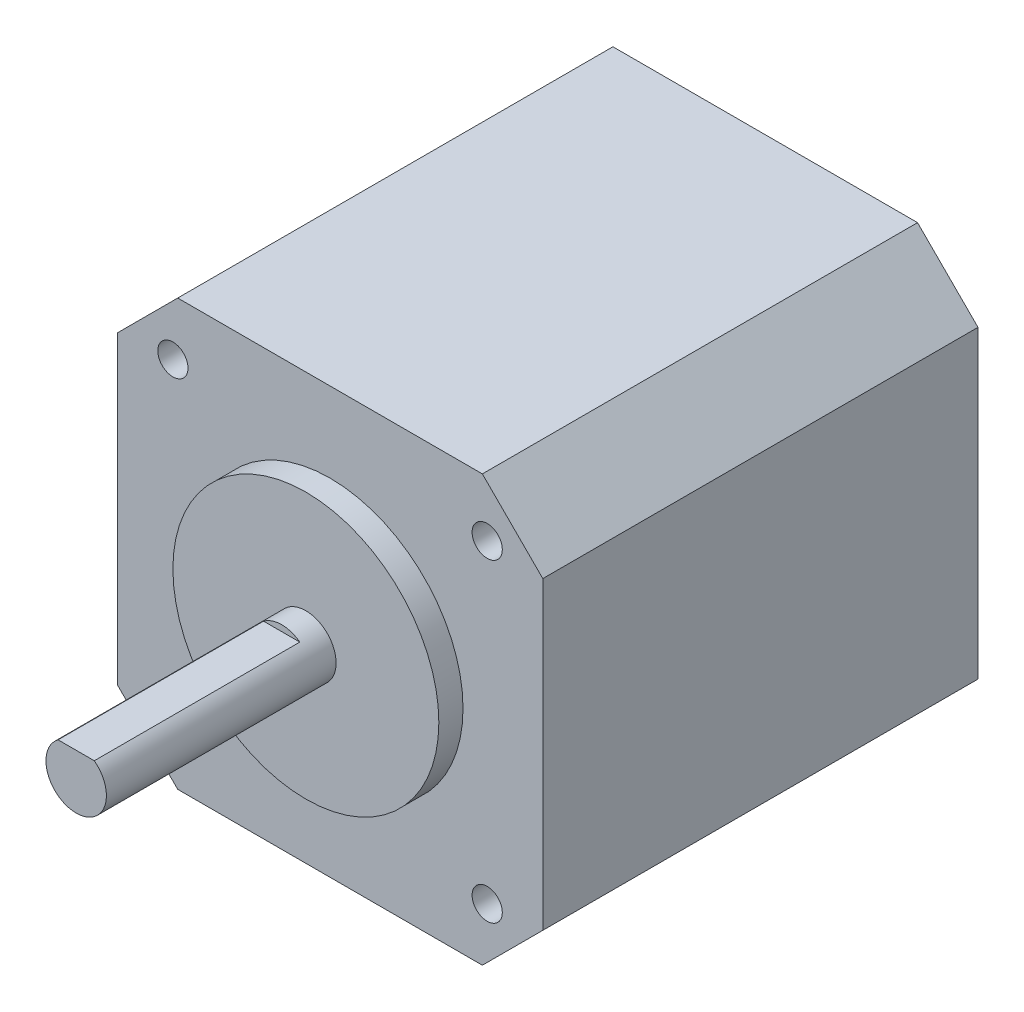
ISO-10303-21;
HEADER;
FILE_DESCRIPTION(('STEP AP214'),'2;1');
FILE_NAME('part.step','',(''),(''),'','','');
FILE_SCHEMA(('AUTOMOTIVE_DESIGN { 1 0 10303 214 1 1 1 1 }'));
ENDSEC;
DATA;
#1=APPLICATION_CONTEXT('core data for automotive mechanical design processes');
#2=APPLICATION_PROTOCOL_DEFINITION('international standard','automotive_design',2000,#1);
#3=PRODUCT_CONTEXT('',#1,'mechanical');
#4=PRODUCT('Part','Part','',(#3));
#5=PRODUCT_RELATED_PRODUCT_CATEGORY('part','',(#4));
#6=PRODUCT_DEFINITION_FORMATION('','',#4);
#7=PRODUCT_DEFINITION_CONTEXT('part definition',#1,'design');
#8=PRODUCT_DEFINITION('design','',#6,#7);
#9=PRODUCT_DEFINITION_SHAPE('','',#8);
#10=(LENGTH_UNIT() NAMED_UNIT(*) SI_UNIT(.MILLI.,.METRE.));
#11=(NAMED_UNIT(*) PLANE_ANGLE_UNIT() SI_UNIT($,.RADIAN.));
#12=(NAMED_UNIT(*) SI_UNIT($,.STERADIAN.) SOLID_ANGLE_UNIT());
#13=UNCERTAINTY_MEASURE_WITH_UNIT(LENGTH_MEASURE(1.E-05),#10,'distance_accuracy_value','');
#14=(GEOMETRIC_REPRESENTATION_CONTEXT(3) GLOBAL_UNCERTAINTY_ASSIGNED_CONTEXT((#13)) GLOBAL_UNIT_ASSIGNED_CONTEXT((#10,
#11,#12)) REPRESENTATION_CONTEXT('',''));
#15=CARTESIAN_POINT('',(0.,0.,0.));
#16=DIRECTION('',(0.,0.,1.));
#17=DIRECTION('',(1.,0.,0.));
#18=AXIS2_PLACEMENT_3D('',#15,#16,#17);
#19=CARTESIAN_POINT('',(0.,0.,38.));
#20=DIRECTION('',(0.,0.,1.));
#21=DIRECTION('',(1.,0.,0.));
#22=AXIS2_PLACEMENT_3D('',#19,#20,#21);
#23=PLANE('',#22);
#24=CARTESIAN_POINT('',(0.,0.,38.));
#25=DIRECTION('',(0.,0.,1.));
#26=DIRECTION('',(1.,0.,0.));
#27=AXIS2_PLACEMENT_3D('',#24,#25,#26);
#28=CIRCLE('',#27,11.);
#29=CARTESIAN_POINT('',(11.,0.,38.));
#30=VERTEX_POINT('',#29);
#31=EDGE_CURVE('E211',#30,#30,#28,.T.);
#32=ORIENTED_EDGE('',*,*,#31,.T.);
#33=EDGE_LOOP('',(#32));
#34=FACE_BOUND('',#33,.T.);
#35=CARTESIAN_POINT('',(0.,0.,38.));
#36=DIRECTION('',(0.,0.,1.));
#37=DIRECTION('',(1.,0.,0.));
#38=AXIS2_PLACEMENT_3D('',#35,#36,#37);
#39=CIRCLE('',#38,2.5);
#40=CARTESIAN_POINT('',(2.5,0.,38.));
#41=VERTEX_POINT('',#40);
#42=EDGE_CURVE('E207',#41,#41,#39,.T.);
#43=ORIENTED_EDGE('',*,*,#42,.F.);
#44=EDGE_LOOP('',(#43));
#45=FACE_BOUND('',#44,.T.);
#46=ADVANCED_FACE('F43',(#34,#45),#23,.T.);
#47=CARTESIAN_POINT('',(-17.6,17.6,36.));
#48=DIRECTION('',(0.,0.,-1.));
#49=DIRECTION('',(-1.,0.,0.));
#50=AXIS2_PLACEMENT_3D('',#47,#48,#49);
#51=PLANE('',#50);
#52=CARTESIAN_POINT('',(-12.9999999999999,13.0000000000001,36.));
#53=DIRECTION('',(0.,0.,1.));
#54=DIRECTION('',(1.,0.,0.));
#55=AXIS2_PLACEMENT_3D('',#52,#53,#54);
#56=CIRCLE('',#55,1.25);
#57=CARTESIAN_POINT('',(-11.7499999999999,13.0000000000001,36.));
#58=VERTEX_POINT('',#57);
#59=EDGE_CURVE('E183',#58,#58,#56,.T.);
#60=ORIENTED_EDGE('',*,*,#59,.F.);
#61=EDGE_LOOP('',(#60));
#62=FACE_BOUND('',#61,.T.);
#63=CARTESIAN_POINT('',(-13.,-13.,36.));
#64=DIRECTION('',(0.,0.,1.));
#65=DIRECTION('',(1.,0.,0.));
#66=AXIS2_PLACEMENT_3D('',#63,#64,#65);
#67=CIRCLE('',#66,1.25);
#68=CARTESIAN_POINT('',(-11.75,-13.,36.));
#69=VERTEX_POINT('',#68);
#70=EDGE_CURVE('E189',#69,#69,#67,.T.);
#71=ORIENTED_EDGE('',*,*,#70,.F.);
#72=EDGE_LOOP('',(#71));
#73=FACE_BOUND('',#72,.T.);
#74=CARTESIAN_POINT('',(13.,-13.,36.));
#75=DIRECTION('',(0.,0.,1.));
#76=DIRECTION('',(1.,0.,0.));
#77=AXIS2_PLACEMENT_3D('',#74,#75,#76);
#78=CIRCLE('',#77,1.25);
#79=CARTESIAN_POINT('',(14.25,-13.,36.));
#80=VERTEX_POINT('',#79);
#81=EDGE_CURVE('E195',#80,#80,#78,.T.);
#82=ORIENTED_EDGE('',*,*,#81,.F.);
#83=EDGE_LOOP('',(#82));
#84=FACE_BOUND('',#83,.T.);
#85=CARTESIAN_POINT('',(13.,13.,36.));
#86=DIRECTION('',(0.,0.,1.));
#87=DIRECTION('',(1.,0.,0.));
#88=AXIS2_PLACEMENT_3D('',#85,#86,#87);
#89=CIRCLE('',#88,1.25);
#90=CARTESIAN_POINT('',(14.25,13.,36.));
#91=VERTEX_POINT('',#90);
#92=EDGE_CURVE('E201',#91,#91,#89,.T.);
#93=ORIENTED_EDGE('',*,*,#92,.F.);
#94=EDGE_LOOP('',(#93));
#95=FACE_BOUND('',#94,.T.);
#96=DIRECTION('',(-1.,0.,0.));
#97=VECTOR('',#96,1.);
#98=CARTESIAN_POINT('',(-17.6,17.6,36.));
#99=LINE('',#98,#97);
#100=CARTESIAN_POINT('',(12.6,17.6,36.));
#101=VERTEX_POINT('',#100);
#102=CARTESIAN_POINT('',(-12.6,17.6,36.));
#103=VERTEX_POINT('',#102);
#104=EDGE_CURVE('E226',#101,#103,#99,.T.);
#105=ORIENTED_EDGE('',*,*,#104,.T.);
#106=DIRECTION('',(0.707106781186549,0.707106781186546,0.));
#107=VECTOR('',#106,1.);
#108=CARTESIAN_POINT('',(-17.6,12.6,36.));
#109=LINE('',#108,#107);
#110=CARTESIAN_POINT('',(-17.6,12.6,36.));
#111=VERTEX_POINT('',#110);
#112=EDGE_CURVE('E265',#103,#111,#109,.F.);
#113=ORIENTED_EDGE('',*,*,#112,.T.);
#114=DIRECTION('',(0.,-1.,0.));
#115=VECTOR('',#114,1.);
#116=CARTESIAN_POINT('',(-17.6,-17.6,36.));
#117=LINE('',#116,#115);
#118=CARTESIAN_POINT('',(-17.6,-12.6,36.));
#119=VERTEX_POINT('',#118);
#120=EDGE_CURVE('E217',#111,#119,#117,.T.);
#121=ORIENTED_EDGE('',*,*,#120,.T.);
#122=DIRECTION('',(-0.707106781186546,0.707106781186549,0.));
#123=VECTOR('',#122,1.);
#124=CARTESIAN_POINT('',(-12.6,-17.6,36.));
#125=LINE('',#124,#123);
#126=CARTESIAN_POINT('',(-12.6,-17.6,36.));
#127=VERTEX_POINT('',#126);
#128=EDGE_CURVE('E263',#119,#127,#125,.F.);
#129=ORIENTED_EDGE('',*,*,#128,.T.);
#130=DIRECTION('',(1.,0.,0.));
#131=VECTOR('',#130,1.);
#132=CARTESIAN_POINT('',(-17.6,-17.6,36.));
#133=LINE('',#132,#131);
#134=CARTESIAN_POINT('',(12.6,-17.6,36.));
#135=VERTEX_POINT('',#134);
#136=EDGE_CURVE('E220',#127,#135,#133,.T.);
#137=ORIENTED_EDGE('',*,*,#136,.T.);
#138=DIRECTION('',(-0.707106781186549,-0.707106781186546,0.));
#139=VECTOR('',#138,1.);
#140=CARTESIAN_POINT('',(17.6,-12.6,36.));
#141=LINE('',#140,#139);
#142=CARTESIAN_POINT('',(17.6,-12.6,36.));
#143=VERTEX_POINT('',#142);
#144=EDGE_CURVE('E261',#135,#143,#141,.F.);
#145=ORIENTED_EDGE('',*,*,#144,.T.);
#146=DIRECTION('',(0.,1.,0.));
#147=VECTOR('',#146,1.);
#148=CARTESIAN_POINT('',(17.6,-17.6,36.));
#149=LINE('',#148,#147);
#150=CARTESIAN_POINT('',(17.6,12.6,36.));
#151=VERTEX_POINT('',#150);
#152=EDGE_CURVE('E224',#143,#151,#149,.T.);
#153=ORIENTED_EDGE('',*,*,#152,.T.);
#154=DIRECTION('',(0.707106781186546,-0.707106781186549,0.));
#155=VECTOR('',#154,1.);
#156=CARTESIAN_POINT('',(12.6,17.6,36.));
#157=LINE('',#156,#155);
#158=EDGE_CURVE('E259',#151,#101,#157,.F.);
#159=ORIENTED_EDGE('',*,*,#158,.T.);
#160=EDGE_LOOP('',(#105,#113,#121,#129,#137,#145,#153,#159));
#161=FACE_BOUND('',#160,.T.);
#162=CARTESIAN_POINT('',(0.,0.,36.));
#163=DIRECTION('',(0.,0.,-1.));
#164=DIRECTION('',(-1.,0.,0.));
#165=AXIS2_PLACEMENT_3D('',#162,#163,#164);
#166=CIRCLE('',#165,11.);
#167=CARTESIAN_POINT('',(-11.,0.,36.));
#168=VERTEX_POINT('',#167);
#169=EDGE_CURVE('E229',#168,#168,#166,.F.);
#170=ORIENTED_EDGE('',*,*,#169,.F.);
#171=EDGE_LOOP('',(#170));
#172=FACE_BOUND('',#171,.T.);
#173=ADVANCED_FACE('F298',(#62,#73,#84,#95,#161,#172),#51,.F.);
#174=CARTESIAN_POINT('',(-17.6,-17.6,36.));
#175=DIRECTION('',(1.,0.,0.));
#176=DIRECTION('',(0.,0.,-1.));
#177=AXIS2_PLACEMENT_3D('',#174,#175,#176);
#178=PLANE('',#177);
#179=ORIENTED_EDGE('',*,*,#120,.F.);
#180=DIRECTION('',(0.,0.,-1.));
#181=VECTOR('',#180,1.);
#182=CARTESIAN_POINT('',(-17.6,12.6,36.));
#183=LINE('',#182,#181);
#184=CARTESIAN_POINT('',(-17.6,12.6,0.));
#185=VERTEX_POINT('',#184);
#186=EDGE_CURVE('E243',#111,#185,#183,.T.);
#187=ORIENTED_EDGE('',*,*,#186,.T.);
#188=DIRECTION('',(0.,-1.,0.));
#189=VECTOR('',#188,1.);
#190=CARTESIAN_POINT('',(-17.6,-17.6,0.));
#191=LINE('',#190,#189);
#192=CARTESIAN_POINT('',(-17.6,-12.6,0.));
#193=VERTEX_POINT('',#192);
#194=EDGE_CURVE('E216',#185,#193,#191,.T.);
#195=ORIENTED_EDGE('',*,*,#194,.T.);
#196=DIRECTION('',(0.,0.,1.));
#197=VECTOR('',#196,1.);
#198=CARTESIAN_POINT('',(-17.6,-12.6,36.));
#199=LINE('',#198,#197);
#200=EDGE_CURVE('E241',#193,#119,#199,.T.);
#201=ORIENTED_EDGE('',*,*,#200,.T.);
#202=EDGE_LOOP('',(#179,#187,#195,#201));
#203=FACE_BOUND('',#202,.T.);
#204=ADVANCED_FACE('F304',(#203),#178,.F.);
#205=CARTESIAN_POINT('',(-17.6,-17.6,36.));
#206=DIRECTION('',(0.,1.,0.));
#207=DIRECTION('',(0.,0.,1.));
#208=AXIS2_PLACEMENT_3D('',#205,#206,#207);
#209=PLANE('',#208);
#210=ORIENTED_EDGE('',*,*,#136,.F.);
#211=DIRECTION('',(0.,0.,-1.));
#212=VECTOR('',#211,1.);
#213=CARTESIAN_POINT('',(-12.6,-17.6,36.));
#214=LINE('',#213,#212);
#215=CARTESIAN_POINT('',(-12.6,-17.6,0.));
#216=VERTEX_POINT('',#215);
#217=EDGE_CURVE('E269',#127,#216,#214,.T.);
#218=ORIENTED_EDGE('',*,*,#217,.T.);
#219=DIRECTION('',(1.,0.,0.));
#220=VECTOR('',#219,1.);
#221=CARTESIAN_POINT('',(-17.6,-17.6,0.));
#222=LINE('',#221,#220);
#223=CARTESIAN_POINT('',(12.6,-17.6,0.));
#224=VERTEX_POINT('',#223);
#225=EDGE_CURVE('E232',#216,#224,#222,.T.);
#226=ORIENTED_EDGE('',*,*,#225,.T.);
#227=DIRECTION('',(0.,0.,1.));
#228=VECTOR('',#227,1.);
#229=CARTESIAN_POINT('',(12.6,-17.6,36.));
#230=LINE('',#229,#228);
#231=EDGE_CURVE('E267',#224,#135,#230,.T.);
#232=ORIENTED_EDGE('',*,*,#231,.T.);
#233=EDGE_LOOP('',(#210,#218,#226,#232));
#234=FACE_BOUND('',#233,.T.);
#235=ADVANCED_FACE('F323',(#234),#209,.F.);
#236=CARTESIAN_POINT('',(17.6,-17.6,36.));
#237=DIRECTION('',(-1.,0.,0.));
#238=DIRECTION('',(0.,0.,1.));
#239=AXIS2_PLACEMENT_3D('',#236,#237,#238);
#240=PLANE('',#239);
#241=ORIENTED_EDGE('',*,*,#152,.F.);
#242=DIRECTION('',(0.,0.,-1.));
#243=VECTOR('',#242,1.);
#244=CARTESIAN_POINT('',(17.6,-12.6,36.));
#245=LINE('',#244,#243);
#246=CARTESIAN_POINT('',(17.6,-12.6,0.));
#247=VERTEX_POINT('',#246);
#248=EDGE_CURVE('E273',#143,#247,#245,.T.);
#249=ORIENTED_EDGE('',*,*,#248,.T.);
#250=DIRECTION('',(0.,1.,0.));
#251=VECTOR('',#250,1.);
#252=CARTESIAN_POINT('',(17.6,-17.6,0.));
#253=LINE('',#252,#251);
#254=CARTESIAN_POINT('',(17.6,12.6,0.));
#255=VERTEX_POINT('',#254);
#256=EDGE_CURVE('E235',#247,#255,#253,.T.);
#257=ORIENTED_EDGE('',*,*,#256,.T.);
#258=DIRECTION('',(0.,0.,1.));
#259=VECTOR('',#258,1.);
#260=CARTESIAN_POINT('',(17.6,12.6,36.));
#261=LINE('',#260,#259);
#262=EDGE_CURVE('E66',#255,#151,#261,.T.);
#263=ORIENTED_EDGE('',*,*,#262,.T.);
#264=EDGE_LOOP('',(#241,#249,#257,#263));
#265=FACE_BOUND('',#264,.T.);
#266=ADVANCED_FACE('F319',(#265),#240,.F.);
#267=CARTESIAN_POINT('',(-17.6,17.6,36.));
#268=DIRECTION('',(0.,-1.,0.));
#269=DIRECTION('',(0.,0.,-1.));
#270=AXIS2_PLACEMENT_3D('',#267,#268,#269);
#271=PLANE('',#270);
#272=DIRECTION('',(-1.,0.,0.));
#273=VECTOR('',#272,1.);
#274=CARTESIAN_POINT('',(-17.6,17.6,0.));
#275=LINE('',#274,#273);
#276=CARTESIAN_POINT('',(12.6,17.6,0.));
#277=VERTEX_POINT('',#276);
#278=CARTESIAN_POINT('',(-12.6,17.6,0.));
#279=VERTEX_POINT('',#278);
#280=EDGE_CURVE('E221',#277,#279,#275,.T.);
#281=ORIENTED_EDGE('',*,*,#280,.T.);
#282=DIRECTION('',(0.,0.,1.));
#283=VECTOR('',#282,1.);
#284=CARTESIAN_POINT('',(-12.6,17.6,36.));
#285=LINE('',#284,#283);
#286=EDGE_CURVE('E257',#279,#103,#285,.T.);
#287=ORIENTED_EDGE('',*,*,#286,.T.);
#288=ORIENTED_EDGE('',*,*,#104,.F.);
#289=DIRECTION('',(0.,0.,-1.));
#290=VECTOR('',#289,1.);
#291=CARTESIAN_POINT('',(12.6,17.6,36.));
#292=LINE('',#291,#290);
#293=EDGE_CURVE('E254',#101,#277,#292,.T.);
#294=ORIENTED_EDGE('',*,*,#293,.T.);
#295=EDGE_LOOP('',(#281,#287,#288,#294));
#296=FACE_BOUND('',#295,.T.);
#297=ADVANCED_FACE('F315',(#296),#271,.F.);
#298=CARTESIAN_POINT('',(-17.6,17.6,0.));
#299=DIRECTION('',(0.,0.,-1.));
#300=DIRECTION('',(-1.,0.,0.));
#301=AXIS2_PLACEMENT_3D('',#298,#299,#300);
#302=PLANE('',#301);
#303=CARTESIAN_POINT('',(-12.9999999999999,13.0000000000001,0.));
#304=DIRECTION('',(0.,0.,-1.));
#305=DIRECTION('',(-1.,0.,0.));
#306=AXIS2_PLACEMENT_3D('',#303,#304,#305);
#307=CIRCLE('',#306,1.25);
#308=CARTESIAN_POINT('',(-14.2499999999999,13.0000000000001,0.));
#309=VERTEX_POINT('',#308);
#310=EDGE_CURVE('E155',#309,#309,#307,.T.);
#311=ORIENTED_EDGE('',*,*,#310,.F.);
#312=EDGE_LOOP('',(#311));
#313=FACE_BOUND('',#312,.T.);
#314=CARTESIAN_POINT('',(-13.,-13.,0.));
#315=DIRECTION('',(0.,0.,-1.));
#316=DIRECTION('',(-1.,0.,0.));
#317=AXIS2_PLACEMENT_3D('',#314,#315,#316);
#318=CIRCLE('',#317,1.25);
#319=CARTESIAN_POINT('',(-14.25,-13.,0.));
#320=VERTEX_POINT('',#319);
#321=EDGE_CURVE('E154',#320,#320,#318,.T.);
#322=ORIENTED_EDGE('',*,*,#321,.F.);
#323=EDGE_LOOP('',(#322));
#324=FACE_BOUND('',#323,.T.);
#325=CARTESIAN_POINT('',(13.,-13.,0.));
#326=DIRECTION('',(0.,0.,-1.));
#327=DIRECTION('',(-1.,0.,0.));
#328=AXIS2_PLACEMENT_3D('',#325,#326,#327);
#329=CIRCLE('',#328,1.25);
#330=CARTESIAN_POINT('',(11.75,-13.,0.));
#331=VERTEX_POINT('',#330);
#332=EDGE_CURVE('E165',#331,#331,#329,.T.);
#333=ORIENTED_EDGE('',*,*,#332,.F.);
#334=EDGE_LOOP('',(#333));
#335=FACE_BOUND('',#334,.T.);
#336=CARTESIAN_POINT('',(13.,13.,0.));
#337=DIRECTION('',(0.,0.,-1.));
#338=DIRECTION('',(-1.,0.,0.));
#339=AXIS2_PLACEMENT_3D('',#336,#337,#338);
#340=CIRCLE('',#339,1.25);
#341=CARTESIAN_POINT('',(11.75,13.,0.));
#342=VERTEX_POINT('',#341);
#343=EDGE_CURVE('E171',#342,#342,#340,.T.);
#344=ORIENTED_EDGE('',*,*,#343,.F.);
#345=EDGE_LOOP('',(#344));
#346=FACE_BOUND('',#345,.T.);
#347=ORIENTED_EDGE('',*,*,#194,.F.);
#348=DIRECTION('',(-0.707106781186549,-0.707106781186546,0.));
#349=VECTOR('',#348,1.);
#350=CARTESIAN_POINT('',(-15.1,15.1,0.));
#351=LINE('',#350,#349);
#352=EDGE_CURVE('E252',#185,#279,#351,.F.);
#353=ORIENTED_EDGE('',*,*,#352,.T.);
#354=ORIENTED_EDGE('',*,*,#280,.F.);
#355=DIRECTION('',(-0.707106781186546,0.707106781186549,0.));
#356=VECTOR('',#355,1.);
#357=CARTESIAN_POINT('',(-2.49999999999994,32.7,0.));
#358=LINE('',#357,#356);
#359=EDGE_CURVE('E246',#277,#255,#358,.F.);
#360=ORIENTED_EDGE('',*,*,#359,.T.);
#361=ORIENTED_EDGE('',*,*,#256,.F.);
#362=DIRECTION('',(0.707106781186549,0.707106781186546,0.));
#363=VECTOR('',#362,1.);
#364=CARTESIAN_POINT('',(15.0999999999999,-15.1000000000001,0.));
#365=LINE('',#364,#363);
#366=EDGE_CURVE('E248',#247,#224,#365,.F.);
#367=ORIENTED_EDGE('',*,*,#366,.T.);
#368=ORIENTED_EDGE('',*,*,#225,.F.);
#369=DIRECTION('',(0.707106781186546,-0.707106781186549,0.));
#370=VECTOR('',#369,1.);
#371=CARTESIAN_POINT('',(-32.7,2.50000000000007,0.));
#372=LINE('',#371,#370);
#373=EDGE_CURVE('E250',#216,#193,#372,.F.);
#374=ORIENTED_EDGE('',*,*,#373,.T.);
#375=EDGE_LOOP('',(#347,#353,#354,#360,#361,#367,#368,#374));
#376=FACE_BOUND('',#375,.T.);
#377=ADVANCED_FACE('F310',(#313,#324,#335,#346,#376),#302,.T.);
#378=CARTESIAN_POINT('',(0.,0.,38.));
#379=DIRECTION('',(0.,0.,-1.));
#380=DIRECTION('',(-1.,0.,0.));
#381=AXIS2_PLACEMENT_3D('',#378,#379,#380);
#382=CYLINDRICAL_SURFACE('',#381,11.);
#383=ORIENTED_EDGE('',*,*,#31,.F.);
#384=EDGE_LOOP('',(#383));
#385=FACE_BOUND('',#384,.T.);
#386=ORIENTED_EDGE('',*,*,#169,.T.);
#387=EDGE_LOOP('',(#386));
#388=FACE_BOUND('',#387,.T.);
#389=ADVANCED_FACE('F294',(#385,#388),#382,.T.);
#390=CARTESIAN_POINT('',(0.,0.,57.));
#391=DIRECTION('',(0.,0.,-1.));
#392=DIRECTION('',(-1.,0.,0.));
#393=AXIS2_PLACEMENT_3D('',#390,#391,#392);
#394=CYLINDRICAL_SURFACE('',#393,2.5);
#395=CARTESIAN_POINT('',(0.,0.,57.));
#396=DIRECTION('',(0.,0.,1.));
#397=DIRECTION('',(1.,0.,0.));
#398=AXIS2_PLACEMENT_3D('',#395,#396,#397);
#399=CIRCLE('',#398,2.5);
#400=CARTESIAN_POINT('',(-1.5,2.,57.));
#401=VERTEX_POINT('',#400);
#402=CARTESIAN_POINT('',(1.5,2.,57.));
#403=VERTEX_POINT('',#402);
#404=EDGE_CURVE('E208',#401,#403,#399,.T.);
#405=ORIENTED_EDGE('',*,*,#404,.F.);
#406=DIRECTION('',(0.,0.,-1.));
#407=VECTOR('',#406,1.);
#408=CARTESIAN_POINT('',(-1.5,2.,57.));
#409=LINE('',#408,#407);
#410=CARTESIAN_POINT('',(-1.5,2.,40.));
#411=VERTEX_POINT('',#410);
#412=EDGE_CURVE('E58',#401,#411,#409,.T.);
#413=ORIENTED_EDGE('',*,*,#412,.T.);
#414=CARTESIAN_POINT('',(0.,0.,40.));
#415=DIRECTION('',(0.,0.,1.));
#416=DIRECTION('',(1.,0.,0.));
#417=AXIS2_PLACEMENT_3D('',#414,#415,#416);
#418=CIRCLE('',#417,2.5);
#419=CARTESIAN_POINT('',(1.5,2.,40.));
#420=VERTEX_POINT('',#419);
#421=EDGE_CURVE('E13',#420,#411,#418,.T.);
#422=ORIENTED_EDGE('',*,*,#421,.F.);
#423=DIRECTION('',(0.,0.,-1.));
#424=VECTOR('',#423,1.);
#425=CARTESIAN_POINT('',(1.5,2.,57.));
#426=LINE('',#425,#424);
#427=EDGE_CURVE('E179',#420,#403,#426,.F.);
#428=ORIENTED_EDGE('',*,*,#427,.T.);
#429=EDGE_LOOP('',(#405,#413,#422,#428));
#430=FACE_BOUND('',#429,.T.);
#431=ORIENTED_EDGE('',*,*,#42,.T.);
#432=EDGE_LOOP('',(#431));
#433=FACE_BOUND('',#432,.T.);
#434=ADVANCED_FACE('F281',(#430,#433),#394,.T.);
#435=CARTESIAN_POINT('',(0.,0.,57.));
#436=DIRECTION('',(0.,0.,1.));
#437=DIRECTION('',(1.,0.,0.));
#438=AXIS2_PLACEMENT_3D('',#435,#436,#437);
#439=PLANE('',#438);
#440=DIRECTION('',(1.,0.,0.));
#441=VECTOR('',#440,1.);
#442=CARTESIAN_POINT('',(0.,2.,57.));
#443=LINE('',#442,#441);
#444=EDGE_CURVE('E51',#401,#403,#443,.T.);
#445=ORIENTED_EDGE('',*,*,#444,.F.);
#446=ORIENTED_EDGE('',*,*,#404,.T.);
#447=EDGE_LOOP('',(#445,#446));
#448=FACE_BOUND('',#447,.T.);
#449=ADVANCED_FACE('F283',(#448),#439,.T.);
#450=CARTESIAN_POINT('',(-17.6,12.6,36.));
#451=DIRECTION('',(0.707106781186546,-0.707106781186549,0.));
#452=DIRECTION('',(0.707106781186549,0.707106781186546,0.));
#453=AXIS2_PLACEMENT_3D('',#450,#451,#452);
#454=PLANE('',#453);
#455=ORIENTED_EDGE('',*,*,#112,.F.);
#456=ORIENTED_EDGE('',*,*,#286,.F.);
#457=ORIENTED_EDGE('',*,*,#352,.F.);
#458=ORIENTED_EDGE('',*,*,#186,.F.);
#459=EDGE_LOOP('',(#455,#456,#457,#458));
#460=FACE_BOUND('',#459,.T.);
#461=ADVANCED_FACE('F285',(#460),#454,.F.);
#462=CARTESIAN_POINT('',(-12.6,-17.6,36.));
#463=DIRECTION('',(0.707106781186549,0.707106781186546,0.));
#464=DIRECTION('',(-0.707106781186546,0.707106781186549,0.));
#465=AXIS2_PLACEMENT_3D('',#462,#463,#464);
#466=PLANE('',#465);
#467=ORIENTED_EDGE('',*,*,#128,.F.);
#468=ORIENTED_EDGE('',*,*,#200,.F.);
#469=ORIENTED_EDGE('',*,*,#373,.F.);
#470=ORIENTED_EDGE('',*,*,#217,.F.);
#471=EDGE_LOOP('',(#467,#468,#469,#470));
#472=FACE_BOUND('',#471,.T.);
#473=ADVANCED_FACE('F291',(#472),#466,.F.);
#474=CARTESIAN_POINT('',(17.6,-12.6,36.));
#475=DIRECTION('',(-0.707106781186546,0.707106781186549,0.));
#476=DIRECTION('',(-0.707106781186549,-0.707106781186546,0.));
#477=AXIS2_PLACEMENT_3D('',#474,#475,#476);
#478=PLANE('',#477);
#479=ORIENTED_EDGE('',*,*,#144,.F.);
#480=ORIENTED_EDGE('',*,*,#231,.F.);
#481=ORIENTED_EDGE('',*,*,#366,.F.);
#482=ORIENTED_EDGE('',*,*,#248,.F.);
#483=EDGE_LOOP('',(#479,#480,#481,#482));
#484=FACE_BOUND('',#483,.T.);
#485=ADVANCED_FACE('F331',(#484),#478,.F.);
#486=CARTESIAN_POINT('',(12.6,17.6,36.));
#487=DIRECTION('',(-0.707106781186549,-0.707106781186546,0.));
#488=DIRECTION('',(0.707106781186546,-0.707106781186549,0.));
#489=AXIS2_PLACEMENT_3D('',#486,#487,#488);
#490=PLANE('',#489);
#491=ORIENTED_EDGE('',*,*,#158,.F.);
#492=ORIENTED_EDGE('',*,*,#262,.F.);
#493=ORIENTED_EDGE('',*,*,#359,.F.);
#494=ORIENTED_EDGE('',*,*,#293,.F.);
#495=EDGE_LOOP('',(#491,#492,#493,#494));
#496=FACE_BOUND('',#495,.T.);
#497=ADVANCED_FACE('F45',(#496),#490,.F.);
#498=CARTESIAN_POINT('',(13.,13.,30.5));
#499=DIRECTION('',(0.,0.,1.));
#500=DIRECTION('',(1.,0.,0.));
#501=AXIS2_PLACEMENT_3D('',#498,#499,#500);
#502=CONICAL_SURFACE('',#501,1.25,1.02974425867665);
#503=CARTESIAN_POINT('',(13.,13.,29.7489242262155));
#504=VERTEX_POINT('',#503);
#505=VERTEX_LOOP('',#504);
#506=FACE_BOUND('',#505,.T.);
#507=CARTESIAN_POINT('',(13.,13.,30.5));
#508=DIRECTION('',(0.,0.,1.));
#509=DIRECTION('',(1.,0.,0.));
#510=AXIS2_PLACEMENT_3D('',#507,#508,#509);
#511=CIRCLE('',#510,1.25);
#512=CARTESIAN_POINT('',(14.25,13.,30.5));
#513=VERTEX_POINT('',#512);
#514=EDGE_CURVE('E204',#513,#513,#511,.T.);
#515=ORIENTED_EDGE('',*,*,#514,.T.);
#516=EDGE_LOOP('',(#515));
#517=FACE_BOUND('',#516,.T.);
#518=ADVANCED_FACE('F338',(#506,#517),#502,.F.);
#519=CARTESIAN_POINT('',(13.,13.,36.));
#520=DIRECTION('',(0.,0.,1.));
#521=DIRECTION('',(1.,0.,0.));
#522=AXIS2_PLACEMENT_3D('',#519,#520,#521);
#523=CYLINDRICAL_SURFACE('',#522,1.25);
#524=ORIENTED_EDGE('',*,*,#514,.F.);
#525=EDGE_LOOP('',(#524));
#526=FACE_BOUND('',#525,.T.);
#527=ORIENTED_EDGE('',*,*,#92,.T.);
#528=EDGE_LOOP('',(#527));
#529=FACE_BOUND('',#528,.T.);
#530=ADVANCED_FACE('F366',(#526,#529),#523,.F.);
#531=CARTESIAN_POINT('',(13.,-13.,30.5));
#532=DIRECTION('',(0.,0.,1.));
#533=DIRECTION('',(1.,0.,0.));
#534=AXIS2_PLACEMENT_3D('',#531,#532,#533);
#535=CONICAL_SURFACE('',#534,1.25,1.02974425867665);
#536=CARTESIAN_POINT('',(13.,-13.,29.7489242262155));
#537=VERTEX_POINT('',#536);
#538=VERTEX_LOOP('',#537);
#539=FACE_BOUND('',#538,.T.);
#540=CARTESIAN_POINT('',(13.,-13.,30.5));
#541=DIRECTION('',(0.,0.,1.));
#542=DIRECTION('',(1.,0.,0.));
#543=AXIS2_PLACEMENT_3D('',#540,#541,#542);
#544=CIRCLE('',#543,1.25);
#545=CARTESIAN_POINT('',(14.25,-13.,30.5));
#546=VERTEX_POINT('',#545);
#547=EDGE_CURVE('E198',#546,#546,#544,.T.);
#548=ORIENTED_EDGE('',*,*,#547,.T.);
#549=EDGE_LOOP('',(#548));
#550=FACE_BOUND('',#549,.T.);
#551=ADVANCED_FACE('F371',(#539,#550),#535,.F.);
#552=CARTESIAN_POINT('',(13.,-13.,36.));
#553=DIRECTION('',(0.,0.,1.));
#554=DIRECTION('',(1.,0.,0.));
#555=AXIS2_PLACEMENT_3D('',#552,#553,#554);
#556=CYLINDRICAL_SURFACE('',#555,1.25);
#557=ORIENTED_EDGE('',*,*,#547,.F.);
#558=EDGE_LOOP('',(#557));
#559=FACE_BOUND('',#558,.T.);
#560=ORIENTED_EDGE('',*,*,#81,.T.);
#561=EDGE_LOOP('',(#560));
#562=FACE_BOUND('',#561,.T.);
#563=ADVANCED_FACE('F378',(#559,#562),#556,.F.);
#564=CARTESIAN_POINT('',(-13.,-13.,30.5));
#565=DIRECTION('',(0.,0.,1.));
#566=DIRECTION('',(1.,0.,0.));
#567=AXIS2_PLACEMENT_3D('',#564,#565,#566);
#568=CONICAL_SURFACE('',#567,1.25,1.02974425867665);
#569=CARTESIAN_POINT('',(-13.,-13.,29.7489242262155));
#570=VERTEX_POINT('',#569);
#571=VERTEX_LOOP('',#570);
#572=FACE_BOUND('',#571,.T.);
#573=CARTESIAN_POINT('',(-13.,-13.,30.5));
#574=DIRECTION('',(0.,0.,1.));
#575=DIRECTION('',(1.,0.,0.));
#576=AXIS2_PLACEMENT_3D('',#573,#574,#575);
#577=CIRCLE('',#576,1.25);
#578=CARTESIAN_POINT('',(-11.75,-13.,30.5));
#579=VERTEX_POINT('',#578);
#580=EDGE_CURVE('E192',#579,#579,#577,.T.);
#581=ORIENTED_EDGE('',*,*,#580,.T.);
#582=EDGE_LOOP('',(#581));
#583=FACE_BOUND('',#582,.T.);
#584=ADVANCED_FACE('F382',(#572,#583),#568,.F.);
#585=CARTESIAN_POINT('',(-13.,-13.,36.));
#586=DIRECTION('',(0.,0.,1.));
#587=DIRECTION('',(1.,0.,0.));
#588=AXIS2_PLACEMENT_3D('',#585,#586,#587);
#589=CYLINDRICAL_SURFACE('',#588,1.25);
#590=ORIENTED_EDGE('',*,*,#580,.F.);
#591=EDGE_LOOP('',(#590));
#592=FACE_BOUND('',#591,.T.);
#593=ORIENTED_EDGE('',*,*,#70,.T.);
#594=EDGE_LOOP('',(#593));
#595=FACE_BOUND('',#594,.T.);
#596=ADVANCED_FACE('F386',(#592,#595),#589,.F.);
#597=CARTESIAN_POINT('',(-12.9999999999999,13.0000000000001,30.5));
#598=DIRECTION('',(0.,0.,1.));
#599=DIRECTION('',(1.,0.,0.));
#600=AXIS2_PLACEMENT_3D('',#597,#598,#599);
#601=CONICAL_SURFACE('',#600,1.25,1.02974425867665);
#602=CARTESIAN_POINT('',(-12.9999999999999,13.0000000000001,29.7489242262155));
#603=VERTEX_POINT('',#602);
#604=VERTEX_LOOP('',#603);
#605=FACE_BOUND('',#604,.T.);
#606=CARTESIAN_POINT('',(-12.9999999999999,13.0000000000001,30.5));
#607=DIRECTION('',(0.,0.,1.));
#608=DIRECTION('',(1.,0.,0.));
#609=AXIS2_PLACEMENT_3D('',#606,#607,#608);
#610=CIRCLE('',#609,1.25);
#611=CARTESIAN_POINT('',(-11.7499999999999,13.0000000000001,30.5));
#612=VERTEX_POINT('',#611);
#613=EDGE_CURVE('E186',#612,#612,#610,.T.);
#614=ORIENTED_EDGE('',*,*,#613,.T.);
#615=EDGE_LOOP('',(#614));
#616=FACE_BOUND('',#615,.T.);
#617=ADVANCED_FACE('F390',(#605,#616),#601,.F.);
#618=CARTESIAN_POINT('',(-12.9999999999999,13.0000000000001,36.));
#619=DIRECTION('',(0.,0.,1.));
#620=DIRECTION('',(1.,0.,0.));
#621=AXIS2_PLACEMENT_3D('',#618,#619,#620);
#622=CYLINDRICAL_SURFACE('',#621,1.25);
#623=ORIENTED_EDGE('',*,*,#613,.F.);
#624=EDGE_LOOP('',(#623));
#625=FACE_BOUND('',#624,.T.);
#626=ORIENTED_EDGE('',*,*,#59,.T.);
#627=EDGE_LOOP('',(#626));
#628=FACE_BOUND('',#627,.T.);
#629=ADVANCED_FACE('F394',(#625,#628),#622,.F.);
#630=CARTESIAN_POINT('',(0.,0.,40.));
#631=DIRECTION('',(0.,0.,1.));
#632=DIRECTION('',(1.,0.,0.));
#633=AXIS2_PLACEMENT_3D('',#630,#631,#632);
#634=PLANE('',#633);
#635=ORIENTED_EDGE('',*,*,#421,.T.);
#636=DIRECTION('',(-1.,0.,0.));
#637=VECTOR('',#636,1.);
#638=CARTESIAN_POINT('',(-2.38148084396319,2.,40.));
#639=LINE('',#638,#637);
#640=EDGE_CURVE('E177',#420,#411,#639,.T.);
#641=ORIENTED_EDGE('',*,*,#640,.F.);
#642=EDGE_LOOP('',(#635,#641));
#643=FACE_BOUND('',#642,.T.);
#644=ADVANCED_FACE('F398',(#643),#634,.T.);
#645=CARTESIAN_POINT('',(-2.38148084396319,2.,33.3022810923517));
#646=DIRECTION('',(0.,-1.,0.));
#647=DIRECTION('',(0.,0.,-1.));
#648=AXIS2_PLACEMENT_3D('',#645,#646,#647);
#649=PLANE('',#648);
#650=ORIENTED_EDGE('',*,*,#444,.T.);
#651=ORIENTED_EDGE('',*,*,#427,.F.);
#652=ORIENTED_EDGE('',*,*,#640,.T.);
#653=ORIENTED_EDGE('',*,*,#412,.F.);
#654=EDGE_LOOP('',(#650,#651,#652,#653));
#655=FACE_BOUND('',#654,.T.);
#656=ADVANCED_FACE('F275',(#655),#649,.F.);
#657=CARTESIAN_POINT('',(13.,13.,5.5));
#658=DIRECTION('',(0.,0.,-1.));
#659=DIRECTION('',(-1.,0.,0.));
#660=AXIS2_PLACEMENT_3D('',#657,#658,#659);
#661=CONICAL_SURFACE('',#660,1.25,1.02974425867665);
#662=CARTESIAN_POINT('',(13.,13.,6.25107577378445));
#663=VERTEX_POINT('',#662);
#664=VERTEX_LOOP('',#663);
#665=FACE_BOUND('',#664,.T.);
#666=CARTESIAN_POINT('',(13.,13.,5.5));
#667=DIRECTION('',(0.,0.,-1.));
#668=DIRECTION('',(-1.,0.,0.));
#669=AXIS2_PLACEMENT_3D('',#666,#667,#668);
#670=CIRCLE('',#669,1.25);
#671=CARTESIAN_POINT('',(11.75,13.,5.5));
#672=VERTEX_POINT('',#671);
#673=EDGE_CURVE('E174',#672,#672,#670,.T.);
#674=ORIENTED_EDGE('',*,*,#673,.T.);
#675=EDGE_LOOP('',(#674));
#676=FACE_BOUND('',#675,.T.);
#677=ADVANCED_FACE('F402',(#665,#676),#661,.F.);
#678=CARTESIAN_POINT('',(13.,13.,0.));
#679=DIRECTION('',(0.,0.,-1.));
#680=DIRECTION('',(-1.,0.,0.));
#681=AXIS2_PLACEMENT_3D('',#678,#679,#680);
#682=CYLINDRICAL_SURFACE('',#681,1.25);
#683=ORIENTED_EDGE('',*,*,#673,.F.);
#684=EDGE_LOOP('',(#683));
#685=FACE_BOUND('',#684,.T.);
#686=ORIENTED_EDGE('',*,*,#343,.T.);
#687=EDGE_LOOP('',(#686));
#688=FACE_BOUND('',#687,.T.);
#689=ADVANCED_FACE('F408',(#685,#688),#682,.F.);
#690=CARTESIAN_POINT('',(13.,-13.,5.5));
#691=DIRECTION('',(0.,0.,-1.));
#692=DIRECTION('',(-1.,0.,0.));
#693=AXIS2_PLACEMENT_3D('',#690,#691,#692);
#694=CONICAL_SURFACE('',#693,1.25,1.02974425867665);
#695=CARTESIAN_POINT('',(13.,-13.,6.25107577378445));
#696=VERTEX_POINT('',#695);
#697=VERTEX_LOOP('',#696);
#698=FACE_BOUND('',#697,.T.);
#699=CARTESIAN_POINT('',(13.,-13.,5.5));
#700=DIRECTION('',(0.,0.,-1.));
#701=DIRECTION('',(-1.,0.,0.));
#702=AXIS2_PLACEMENT_3D('',#699,#700,#701);
#703=CIRCLE('',#702,1.25);
#704=CARTESIAN_POINT('',(11.75,-13.,5.5));
#705=VERTEX_POINT('',#704);
#706=EDGE_CURVE('E168',#705,#705,#703,.T.);
#707=ORIENTED_EDGE('',*,*,#706,.T.);
#708=EDGE_LOOP('',(#707));
#709=FACE_BOUND('',#708,.T.);
#710=ADVANCED_FACE('F412',(#698,#709),#694,.F.);
#711=CARTESIAN_POINT('',(13.,-13.,0.));
#712=DIRECTION('',(0.,0.,-1.));
#713=DIRECTION('',(-1.,0.,0.));
#714=AXIS2_PLACEMENT_3D('',#711,#712,#713);
#715=CYLINDRICAL_SURFACE('',#714,1.25);
#716=ORIENTED_EDGE('',*,*,#706,.F.);
#717=EDGE_LOOP('',(#716));
#718=FACE_BOUND('',#717,.T.);
#719=ORIENTED_EDGE('',*,*,#332,.T.);
#720=EDGE_LOOP('',(#719));
#721=FACE_BOUND('',#720,.T.);
#722=ADVANCED_FACE('F416',(#718,#721),#715,.F.);
#723=CARTESIAN_POINT('',(-13.,-13.,5.5));
#724=DIRECTION('',(0.,0.,-1.));
#725=DIRECTION('',(-1.,0.,0.));
#726=AXIS2_PLACEMENT_3D('',#723,#724,#725);
#727=CONICAL_SURFACE('',#726,1.25,1.02974425867665);
#728=CARTESIAN_POINT('',(-13.,-13.,6.25107577378445));
#729=VERTEX_POINT('',#728);
#730=VERTEX_LOOP('',#729);
#731=FACE_BOUND('',#730,.T.);
#732=CARTESIAN_POINT('',(-13.,-13.,5.5));
#733=DIRECTION('',(0.,0.,-1.));
#734=DIRECTION('',(-1.,0.,0.));
#735=AXIS2_PLACEMENT_3D('',#732,#733,#734);
#736=CIRCLE('',#735,1.25);
#737=CARTESIAN_POINT('',(-14.25,-13.,5.5));
#738=VERTEX_POINT('',#737);
#739=EDGE_CURVE('E158',#738,#738,#736,.T.);
#740=ORIENTED_EDGE('',*,*,#739,.T.);
#741=EDGE_LOOP('',(#740));
#742=FACE_BOUND('',#741,.T.);
#743=ADVANCED_FACE('F420',(#731,#742),#727,.F.);
#744=CARTESIAN_POINT('',(-13.,-13.,0.));
#745=DIRECTION('',(0.,0.,-1.));
#746=DIRECTION('',(-1.,0.,0.));
#747=AXIS2_PLACEMENT_3D('',#744,#745,#746);
#748=CYLINDRICAL_SURFACE('',#747,1.25);
#749=ORIENTED_EDGE('',*,*,#739,.F.);
#750=EDGE_LOOP('',(#749));
#751=FACE_BOUND('',#750,.T.);
#752=ORIENTED_EDGE('',*,*,#321,.T.);
#753=EDGE_LOOP('',(#752));
#754=FACE_BOUND('',#753,.T.);
#755=ADVANCED_FACE('F148',(#751,#754),#748,.F.);
#756=CARTESIAN_POINT('',(-12.9999999999999,13.0000000000001,5.5));
#757=DIRECTION('',(0.,0.,-1.));
#758=DIRECTION('',(-1.,0.,0.));
#759=AXIS2_PLACEMENT_3D('',#756,#757,#758);
#760=CONICAL_SURFACE('',#759,1.25,1.02974425867665);
#761=CARTESIAN_POINT('',(-12.9999999999999,13.0000000000001,6.25107577378445));
#762=VERTEX_POINT('',#761);
#763=VERTEX_LOOP('',#762);
#764=FACE_BOUND('',#763,.T.);
#765=CARTESIAN_POINT('',(-12.9999999999999,13.0000000000001,5.5));
#766=DIRECTION('',(0.,0.,-1.));
#767=DIRECTION('',(-1.,0.,0.));
#768=AXIS2_PLACEMENT_3D('',#765,#766,#767);
#769=CIRCLE('',#768,1.25);
#770=CARTESIAN_POINT('',(-14.2499999999999,13.0000000000001,5.5));
#771=VERTEX_POINT('',#770);
#772=EDGE_CURVE('E152',#771,#771,#769,.T.);
#773=ORIENTED_EDGE('',*,*,#772,.T.);
#774=EDGE_LOOP('',(#773));
#775=FACE_BOUND('',#774,.T.);
#776=ADVANCED_FACE('F144',(#764,#775),#760,.F.);
#777=CARTESIAN_POINT('',(-12.9999999999999,13.0000000000001,0.));
#778=DIRECTION('',(0.,0.,-1.));
#779=DIRECTION('',(-1.,0.,0.));
#780=AXIS2_PLACEMENT_3D('',#777,#778,#779);
#781=CYLINDRICAL_SURFACE('',#780,1.25);
#782=ORIENTED_EDGE('',*,*,#772,.F.);
#783=EDGE_LOOP('',(#782));
#784=FACE_BOUND('',#783,.T.);
#785=ORIENTED_EDGE('',*,*,#310,.T.);
#786=EDGE_LOOP('',(#785));
#787=FACE_BOUND('',#786,.T.);
#788=ADVANCED_FACE('F147',(#784,#787),#781,.F.);
#789=CLOSED_SHELL('',(#46,#173,#204,#235,#266,#297,#377,#389,#434,#449,#461,#473,#485,#497,#518,
#530,#551,#563,#584,#596,#617,#629,#644,#656,#677,#689,#710,#722,#743,#755,#776,#788));
#790=MANIFOLD_SOLID_BREP('B2',#789);
#791=ADVANCED_BREP_SHAPE_REPRESENTATION('',(#18,#790),#14);
#792=SHAPE_DEFINITION_REPRESENTATION(#9,#791);
ENDSEC;
END-ISO-10303-21;
